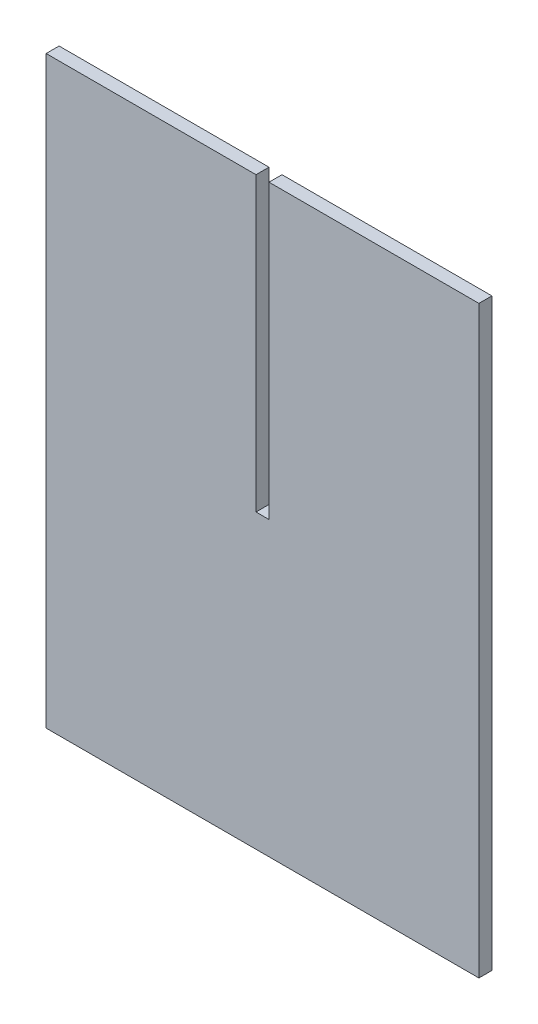
ISO-10303-21;
HEADER;
FILE_DESCRIPTION(('STEP AP214'),'2;1');
FILE_NAME('part.step','',(''),(''),'','','');
FILE_SCHEMA(('AUTOMOTIVE_DESIGN { 1 0 10303 214 1 1 1 1 }'));
ENDSEC;
DATA;
#1=APPLICATION_CONTEXT('core data for automotive mechanical design processes');
#2=APPLICATION_PROTOCOL_DEFINITION('international standard','automotive_design',2000,#1);
#3=PRODUCT_CONTEXT('',#1,'mechanical');
#4=PRODUCT('Part','Part','',(#3));
#5=PRODUCT_RELATED_PRODUCT_CATEGORY('part','',(#4));
#6=PRODUCT_DEFINITION_FORMATION('','',#4);
#7=PRODUCT_DEFINITION_CONTEXT('part definition',#1,'design');
#8=PRODUCT_DEFINITION('design','',#6,#7);
#9=PRODUCT_DEFINITION_SHAPE('','',#8);
#10=(LENGTH_UNIT() NAMED_UNIT(*) SI_UNIT(.MILLI.,.METRE.));
#11=(NAMED_UNIT(*) PLANE_ANGLE_UNIT() SI_UNIT($,.RADIAN.));
#12=(NAMED_UNIT(*) SI_UNIT($,.STERADIAN.) SOLID_ANGLE_UNIT());
#13=UNCERTAINTY_MEASURE_WITH_UNIT(LENGTH_MEASURE(1.E-05),#10,'distance_accuracy_value','');
#14=(GEOMETRIC_REPRESENTATION_CONTEXT(3) GLOBAL_UNCERTAINTY_ASSIGNED_CONTEXT((#13)) GLOBAL_UNIT_ASSIGNED_CONTEXT((#10,
#11,#12)) REPRESENTATION_CONTEXT('',''));
#15=CARTESIAN_POINT('',(0.,0.,0.));
#16=DIRECTION('',(0.,0.,1.));
#17=DIRECTION('',(1.,0.,0.));
#18=AXIS2_PLACEMENT_3D('',#15,#16,#17);
#19=CARTESIAN_POINT('',(-50.,67.5,3.));
#20=DIRECTION('',(0.,1.,0.));
#21=DIRECTION('',(0.,0.,1.));
#22=AXIS2_PLACEMENT_3D('',#19,#20,#21);
#23=PLANE('',#22);
#24=DIRECTION('',(0.,0.,1.));
#25=VECTOR('',#24,1.);
#26=CARTESIAN_POINT('',(-1.5,67.5,0.));
#27=LINE('',#26,#25);
#28=CARTESIAN_POINT('',(-1.5,67.5,0.));
#29=VERTEX_POINT('',#28);
#30=CARTESIAN_POINT('',(-1.5,67.5,3.));
#31=VERTEX_POINT('',#30);
#32=EDGE_CURVE('E152',#29,#31,#27,.T.);
#33=ORIENTED_EDGE('',*,*,#32,.F.);
#34=DIRECTION('',(1.,0.,0.));
#35=VECTOR('',#34,1.);
#36=CARTESIAN_POINT('',(-50.,67.5,0.));
#37=LINE('',#36,#35);
#38=CARTESIAN_POINT('',(-50.,67.5,0.));
#39=VERTEX_POINT('',#38);
#40=EDGE_CURVE('E178',#39,#29,#37,.T.);
#41=ORIENTED_EDGE('',*,*,#40,.F.);
#42=DIRECTION('',(0.,0.,-1.));
#43=VECTOR('',#42,1.);
#44=CARTESIAN_POINT('',(-50.,67.5,3.));
#45=LINE('',#44,#43);
#46=CARTESIAN_POINT('',(-50.,67.5,3.));
#47=VERTEX_POINT('',#46);
#48=EDGE_CURVE('E186',#47,#39,#45,.T.);
#49=ORIENTED_EDGE('',*,*,#48,.F.);
#50=DIRECTION('',(1.,0.,0.));
#51=VECTOR('',#50,1.);
#52=CARTESIAN_POINT('',(-50.,67.5,3.));
#53=LINE('',#52,#51);
#54=EDGE_CURVE('E164',#47,#31,#53,.T.);
#55=ORIENTED_EDGE('',*,*,#54,.T.);
#56=EDGE_LOOP('',(#33,#41,#49,#55));
#57=FACE_BOUND('',#56,.T.);
#58=ADVANCED_FACE('F39',(#57),#23,.T.);
#59=CARTESIAN_POINT('',(-50.,-67.5,3.));
#60=DIRECTION('',(0.,1.,0.));
#61=DIRECTION('',(0.,0.,1.));
#62=AXIS2_PLACEMENT_3D('',#59,#60,#61);
#63=PLANE('',#62);
#64=DIRECTION('',(1.,0.,0.));
#65=VECTOR('',#64,1.);
#66=CARTESIAN_POINT('',(-50.,-67.5,0.));
#67=LINE('',#66,#65);
#68=CARTESIAN_POINT('',(-50.,-67.5,0.));
#69=VERTEX_POINT('',#68);
#70=CARTESIAN_POINT('',(50.,-67.5,0.));
#71=VERTEX_POINT('',#70);
#72=EDGE_CURVE('E151',#69,#71,#67,.T.);
#73=ORIENTED_EDGE('',*,*,#72,.T.);
#74=DIRECTION('',(0.,0.,-1.));
#75=VECTOR('',#74,1.);
#76=CARTESIAN_POINT('',(50.,-67.5,3.));
#77=LINE('',#76,#75);
#78=CARTESIAN_POINT('',(50.,-67.5,3.));
#79=VERTEX_POINT('',#78);
#80=EDGE_CURVE('E11',#79,#71,#77,.T.);
#81=ORIENTED_EDGE('',*,*,#80,.F.);
#82=DIRECTION('',(1.,0.,0.));
#83=VECTOR('',#82,1.);
#84=CARTESIAN_POINT('',(-50.,-67.5,3.));
#85=LINE('',#84,#83);
#86=CARTESIAN_POINT('',(-50.,-67.5,3.));
#87=VERTEX_POINT('',#86);
#88=EDGE_CURVE('E157',#87,#79,#85,.T.);
#89=ORIENTED_EDGE('',*,*,#88,.F.);
#90=DIRECTION('',(0.,0.,-1.));
#91=VECTOR('',#90,1.);
#92=CARTESIAN_POINT('',(-50.,-67.5,3.));
#93=LINE('',#92,#91);
#94=EDGE_CURVE('E64',#87,#69,#93,.T.);
#95=ORIENTED_EDGE('',*,*,#94,.T.);
#96=EDGE_LOOP('',(#73,#81,#89,#95));
#97=FACE_BOUND('',#96,.T.);
#98=ADVANCED_FACE('F41',(#97),#63,.F.);
#99=CARTESIAN_POINT('',(50.,-67.5,3.));
#100=DIRECTION('',(-1.,0.,0.));
#101=DIRECTION('',(0.,0.,1.));
#102=AXIS2_PLACEMENT_3D('',#99,#100,#101);
#103=PLANE('',#102);
#104=DIRECTION('',(0.,1.,0.));
#105=VECTOR('',#104,1.);
#106=CARTESIAN_POINT('',(50.,-67.5,0.));
#107=LINE('',#106,#105);
#108=CARTESIAN_POINT('',(50.,67.5,0.));
#109=VERTEX_POINT('',#108);
#110=EDGE_CURVE('E173',#71,#109,#107,.T.);
#111=ORIENTED_EDGE('',*,*,#110,.T.);
#112=DIRECTION('',(0.,0.,-1.));
#113=VECTOR('',#112,1.);
#114=CARTESIAN_POINT('',(50.,67.5,3.));
#115=LINE('',#114,#113);
#116=CARTESIAN_POINT('',(50.,67.5,3.));
#117=VERTEX_POINT('',#116);
#118=EDGE_CURVE('E48',#117,#109,#115,.T.);
#119=ORIENTED_EDGE('',*,*,#118,.F.);
#120=DIRECTION('',(0.,1.,0.));
#121=VECTOR('',#120,1.);
#122=CARTESIAN_POINT('',(50.,-67.5,3.));
#123=LINE('',#122,#121);
#124=EDGE_CURVE('E90',#79,#117,#123,.T.);
#125=ORIENTED_EDGE('',*,*,#124,.F.);
#126=ORIENTED_EDGE('',*,*,#80,.T.);
#127=EDGE_LOOP('',(#111,#119,#125,#126));
#128=FACE_BOUND('',#127,.T.);
#129=ADVANCED_FACE('F193',(#128),#103,.F.);
#130=DIRECTION('',(0.,0.,1.));
#131=VECTOR('',#130,1.);
#132=CARTESIAN_POINT('',(1.5,67.5,0.));
#133=LINE('',#132,#131);
#134=CARTESIAN_POINT('',(1.5,67.5,0.));
#135=VERTEX_POINT('',#134);
#136=CARTESIAN_POINT('',(1.5,67.5,3.));
#137=VERTEX_POINT('',#136);
#138=EDGE_CURVE('E55',#135,#137,#133,.T.);
#139=ORIENTED_EDGE('',*,*,#138,.T.);
#140=EDGE_CURVE('E163',#137,#117,#53,.T.);
#141=ORIENTED_EDGE('',*,*,#140,.T.);
#142=ORIENTED_EDGE('',*,*,#118,.T.);
#143=EDGE_CURVE('E177',#135,#109,#37,.T.);
#144=ORIENTED_EDGE('',*,*,#143,.F.);
#145=EDGE_LOOP('',(#139,#141,#142,#144));
#146=FACE_BOUND('',#145,.T.);
#147=ADVANCED_FACE('F191',(#146),#23,.T.);
#148=CARTESIAN_POINT('',(-50.,-67.5,3.));
#149=DIRECTION('',(-1.,0.,0.));
#150=DIRECTION('',(0.,0.,1.));
#151=AXIS2_PLACEMENT_3D('',#148,#149,#150);
#152=PLANE('',#151);
#153=DIRECTION('',(0.,1.,0.));
#154=VECTOR('',#153,1.);
#155=CARTESIAN_POINT('',(-50.,-67.5,0.));
#156=LINE('',#155,#154);
#157=EDGE_CURVE('E160',#69,#39,#156,.T.);
#158=ORIENTED_EDGE('',*,*,#157,.F.);
#159=ORIENTED_EDGE('',*,*,#94,.F.);
#160=DIRECTION('',(0.,1.,0.));
#161=VECTOR('',#160,1.);
#162=CARTESIAN_POINT('',(-50.,-67.5,3.));
#163=LINE('',#162,#161);
#164=EDGE_CURVE('E168',#87,#47,#163,.T.);
#165=ORIENTED_EDGE('',*,*,#164,.T.);
#166=ORIENTED_EDGE('',*,*,#48,.T.);
#167=EDGE_LOOP('',(#158,#159,#165,#166));
#168=FACE_BOUND('',#167,.T.);
#169=ADVANCED_FACE('F197',(#168),#152,.T.);
#170=CARTESIAN_POINT('',(0.,0.,3.));
#171=DIRECTION('',(0.,0.,1.));
#172=DIRECTION('',(1.,0.,0.));
#173=AXIS2_PLACEMENT_3D('',#170,#171,#172);
#174=PLANE('',#173);
#175=DIRECTION('',(0.,-1.,0.));
#176=VECTOR('',#175,1.);
#177=CARTESIAN_POINT('',(-1.5,0.,3.));
#178=LINE('',#177,#176);
#179=CARTESIAN_POINT('',(-1.5,0.,3.));
#180=VERTEX_POINT('',#179);
#181=EDGE_CURVE('E135',#31,#180,#178,.T.);
#182=ORIENTED_EDGE('',*,*,#181,.F.);
#183=ORIENTED_EDGE('',*,*,#54,.F.);
#184=ORIENTED_EDGE('',*,*,#164,.F.);
#185=ORIENTED_EDGE('',*,*,#88,.T.);
#186=ORIENTED_EDGE('',*,*,#124,.T.);
#187=ORIENTED_EDGE('',*,*,#140,.F.);
#188=DIRECTION('',(0.,1.,0.));
#189=VECTOR('',#188,1.);
#190=CARTESIAN_POINT('',(1.5,0.,3.));
#191=LINE('',#190,#189);
#192=CARTESIAN_POINT('',(1.5,0.,3.));
#193=VERTEX_POINT('',#192);
#194=EDGE_CURVE('E139',#193,#137,#191,.T.);
#195=ORIENTED_EDGE('',*,*,#194,.F.);
#196=DIRECTION('',(1.,0.,0.));
#197=VECTOR('',#196,1.);
#198=CARTESIAN_POINT('',(-1.5,0.,3.));
#199=LINE('',#198,#197);
#200=EDGE_CURVE('E121',#180,#193,#199,.T.);
#201=ORIENTED_EDGE('',*,*,#200,.F.);
#202=EDGE_LOOP('',(#182,#183,#184,#185,#186,#187,#195,#201));
#203=FACE_BOUND('',#202,.T.);
#204=ADVANCED_FACE('F207',(#203),#174,.T.);
#205=CARTESIAN_POINT('',(0.,0.,0.));
#206=DIRECTION('',(0.,0.,1.));
#207=DIRECTION('',(1.,0.,0.));
#208=AXIS2_PLACEMENT_3D('',#205,#206,#207);
#209=PLANE('',#208);
#210=ORIENTED_EDGE('',*,*,#40,.T.);
#211=DIRECTION('',(0.,-1.,0.));
#212=VECTOR('',#211,1.);
#213=CARTESIAN_POINT('',(-1.5,0.,0.));
#214=LINE('',#213,#212);
#215=CARTESIAN_POINT('',(-1.5,0.,0.));
#216=VERTEX_POINT('',#215);
#217=EDGE_CURVE('E124',#29,#216,#214,.T.);
#218=ORIENTED_EDGE('',*,*,#217,.T.);
#219=DIRECTION('',(1.,0.,0.));
#220=VECTOR('',#219,1.);
#221=CARTESIAN_POINT('',(-1.5,0.,0.));
#222=LINE('',#221,#220);
#223=CARTESIAN_POINT('',(1.5,0.,0.));
#224=VERTEX_POINT('',#223);
#225=EDGE_CURVE('E118',#216,#224,#222,.T.);
#226=ORIENTED_EDGE('',*,*,#225,.T.);
#227=DIRECTION('',(0.,1.,0.));
#228=VECTOR('',#227,1.);
#229=CARTESIAN_POINT('',(1.5,0.,0.));
#230=LINE('',#229,#228);
#231=EDGE_CURVE('E126',#224,#135,#230,.T.);
#232=ORIENTED_EDGE('',*,*,#231,.T.);
#233=ORIENTED_EDGE('',*,*,#143,.T.);
#234=ORIENTED_EDGE('',*,*,#110,.F.);
#235=ORIENTED_EDGE('',*,*,#72,.F.);
#236=ORIENTED_EDGE('',*,*,#157,.T.);
#237=EDGE_LOOP('',(#210,#218,#226,#232,#233,#234,#235,#236));
#238=FACE_BOUND('',#237,.T.);
#239=ADVANCED_FACE('F133',(#238),#209,.F.);
#240=CARTESIAN_POINT('',(-1.5,0.,0.));
#241=DIRECTION('',(0.,-1.,0.));
#242=DIRECTION('',(0.,0.,-1.));
#243=AXIS2_PLACEMENT_3D('',#240,#241,#242);
#244=PLANE('',#243);
#245=ORIENTED_EDGE('',*,*,#200,.T.);
#246=DIRECTION('',(0.,0.,1.));
#247=VECTOR('',#246,1.);
#248=CARTESIAN_POINT('',(1.5,0.,0.));
#249=LINE('',#248,#247);
#250=EDGE_CURVE('E115',#224,#193,#249,.T.);
#251=ORIENTED_EDGE('',*,*,#250,.F.);
#252=ORIENTED_EDGE('',*,*,#225,.F.);
#253=DIRECTION('',(0.,0.,1.));
#254=VECTOR('',#253,1.);
#255=CARTESIAN_POINT('',(-1.5,0.,0.));
#256=LINE('',#255,#254);
#257=EDGE_CURVE('E148',#216,#180,#256,.T.);
#258=ORIENTED_EDGE('',*,*,#257,.T.);
#259=EDGE_LOOP('',(#245,#251,#252,#258));
#260=FACE_BOUND('',#259,.T.);
#261=ADVANCED_FACE('F116',(#260),#244,.F.);
#262=CARTESIAN_POINT('',(-1.5,0.,0.));
#263=DIRECTION('',(-1.,0.,0.));
#264=DIRECTION('',(0.,0.,1.));
#265=AXIS2_PLACEMENT_3D('',#262,#263,#264);
#266=PLANE('',#265);
#267=ORIENTED_EDGE('',*,*,#181,.T.);
#268=ORIENTED_EDGE('',*,*,#257,.F.);
#269=ORIENTED_EDGE('',*,*,#217,.F.);
#270=ORIENTED_EDGE('',*,*,#32,.T.);
#271=EDGE_LOOP('',(#267,#268,#269,#270));
#272=FACE_BOUND('',#271,.T.);
#273=ADVANCED_FACE('F205',(#272),#266,.F.);
#274=CARTESIAN_POINT('',(1.5,0.,0.));
#275=DIRECTION('',(1.,0.,0.));
#276=DIRECTION('',(0.,0.,-1.));
#277=AXIS2_PLACEMENT_3D('',#274,#275,#276);
#278=PLANE('',#277);
#279=ORIENTED_EDGE('',*,*,#194,.T.);
#280=ORIENTED_EDGE('',*,*,#138,.F.);
#281=ORIENTED_EDGE('',*,*,#231,.F.);
#282=ORIENTED_EDGE('',*,*,#250,.T.);
#283=EDGE_LOOP('',(#279,#280,#281,#282));
#284=FACE_BOUND('',#283,.T.);
#285=ADVANCED_FACE('F127',(#284),#278,.F.);
#286=CLOSED_SHELL('',(#58,#98,#129,#147,#169,#204,#239,#261,#273,#285));
#287=MANIFOLD_SOLID_BREP('B2',#286);
#288=ADVANCED_BREP_SHAPE_REPRESENTATION('',(#18,#287),#14);
#289=SHAPE_DEFINITION_REPRESENTATION(#9,#288);
ENDSEC;
END-ISO-10303-21;
